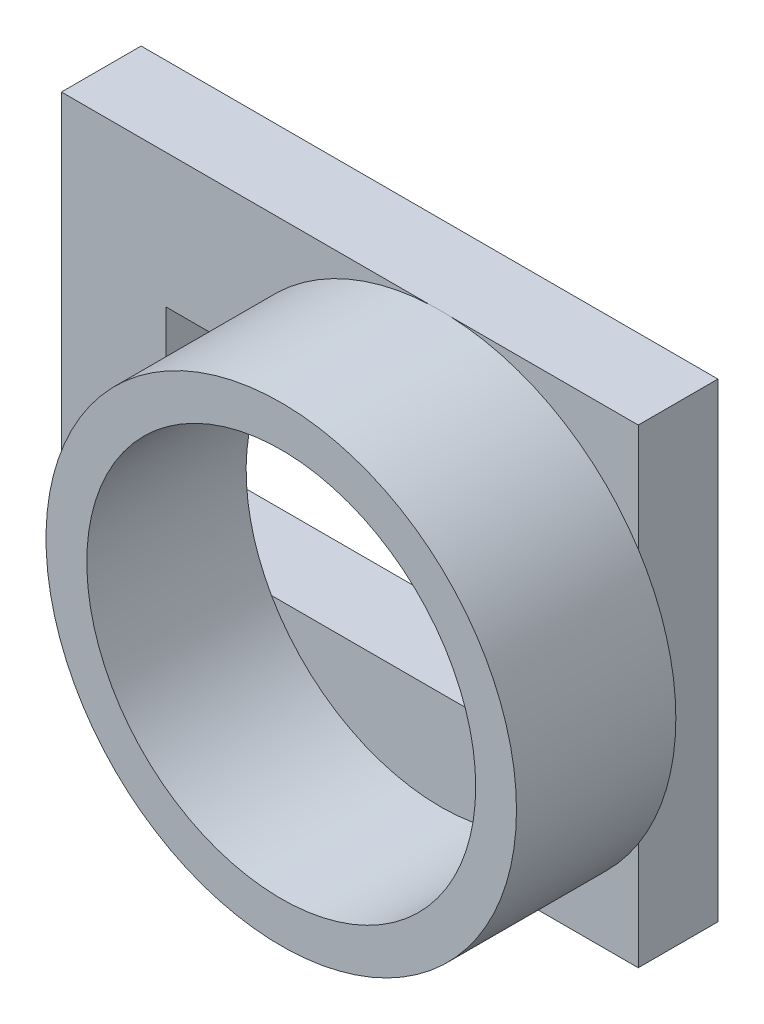
ISO-10303-21;
HEADER;
FILE_DESCRIPTION(('STEP AP214'),'2;1');
FILE_NAME('part.step','',(''),(''),'','','');
FILE_SCHEMA(('AUTOMOTIVE_DESIGN { 1 0 10303 214 1 1 1 1 }'));
ENDSEC;
DATA;
#1=APPLICATION_CONTEXT('core data for automotive mechanical design processes');
#2=APPLICATION_PROTOCOL_DEFINITION('international standard','automotive_design',2000,#1);
#3=PRODUCT_CONTEXT('',#1,'mechanical');
#4=PRODUCT('Part','Part','',(#3));
#5=PRODUCT_RELATED_PRODUCT_CATEGORY('part','',(#4));
#6=PRODUCT_DEFINITION_FORMATION('','',#4);
#7=PRODUCT_DEFINITION_CONTEXT('part definition',#1,'design');
#8=PRODUCT_DEFINITION('design','',#6,#7);
#9=PRODUCT_DEFINITION_SHAPE('','',#8);
#10=(LENGTH_UNIT() NAMED_UNIT(*) SI_UNIT(.MILLI.,.METRE.));
#11=(NAMED_UNIT(*) PLANE_ANGLE_UNIT() SI_UNIT($,.RADIAN.));
#12=(NAMED_UNIT(*) SI_UNIT($,.STERADIAN.) SOLID_ANGLE_UNIT());
#13=UNCERTAINTY_MEASURE_WITH_UNIT(LENGTH_MEASURE(1.E-05),#10,'distance_accuracy_value','');
#14=(GEOMETRIC_REPRESENTATION_CONTEXT(3) GLOBAL_UNCERTAINTY_ASSIGNED_CONTEXT((#13)) GLOBAL_UNIT_ASSIGNED_CONTEXT((#10,
#11,#12)) REPRESENTATION_CONTEXT('',''));
#15=CARTESIAN_POINT('',(0.,0.,0.));
#16=DIRECTION('',(0.,0.,1.));
#17=DIRECTION('',(1.,0.,0.));
#18=AXIS2_PLACEMENT_3D('',#15,#16,#17);
#19=CARTESIAN_POINT('',(0.,0.,5.));
#20=DIRECTION('',(0.,0.,-1.));
#21=DIRECTION('',(-1.,0.,0.));
#22=AXIS2_PLACEMENT_3D('',#19,#20,#21);
#23=PLANE('',#22);
#24=CARTESIAN_POINT('',(23.79465,14.75,5.));
#25=DIRECTION('',(0.,0.,1.));
#26=DIRECTION('',(1.,0.,0.));
#27=AXIS2_PLACEMENT_3D('',#24,#25,#26);
#28=CIRCLE('',#27,14.763665);
#29=CARTESIAN_POINT('',(36.2,22.7545671719166,5.));
#30=VERTEX_POINT('',#29);
#31=CARTESIAN_POINT('',(24.4297123845143,29.5,5.));
#32=VERTEX_POINT('',#31);
#33=EDGE_CURVE('E180',#30,#32,#28,.T.);
#34=ORIENTED_EDGE('',*,*,#33,.F.);
#35=DIRECTION('',(0.,1.,0.));
#36=VECTOR('',#35,1.);
#37=CARTESIAN_POINT('',(36.2,0.,5.));
#38=LINE('',#37,#36);
#39=CARTESIAN_POINT('',(36.2,29.5,5.));
#40=VERTEX_POINT('',#39);
#41=EDGE_CURVE('E173',#30,#40,#38,.T.);
#42=ORIENTED_EDGE('',*,*,#41,.T.);
#43=DIRECTION('',(-1.,0.,0.));
#44=VECTOR('',#43,1.);
#45=CARTESIAN_POINT('',(0.,29.5,5.));
#46=LINE('',#45,#44);
#47=EDGE_CURVE('E191',#40,#32,#46,.T.);
#48=ORIENTED_EDGE('',*,*,#47,.T.);
#49=EDGE_LOOP('',(#34,#42,#48));
#50=FACE_BOUND('',#49,.T.);
#51=ADVANCED_FACE('F41',(#50),#23,.F.);
#52=CARTESIAN_POINT('',(23.1595876154857,29.5,5.));
#53=VERTEX_POINT('',#52);
#54=CARTESIAN_POINT('',(10.4663603785885,21.1,5.));
#55=VERTEX_POINT('',#54);
#56=EDGE_CURVE('E11',#53,#55,#28,.T.);
#57=ORIENTED_EDGE('',*,*,#56,.F.);
#58=CARTESIAN_POINT('',(0.,29.5,5.));
#59=VERTEX_POINT('',#58);
#60=EDGE_CURVE('E202',#53,#59,#46,.T.);
#61=ORIENTED_EDGE('',*,*,#60,.T.);
#62=DIRECTION('',(0.,-1.,0.));
#63=VECTOR('',#62,1.);
#64=CARTESIAN_POINT('',(0.,0.,5.));
#65=LINE('',#64,#63);
#66=CARTESIAN_POINT('',(0.,0.,5.));
#67=VERTEX_POINT('',#66);
#68=EDGE_CURVE('E326',#59,#67,#65,.T.);
#69=ORIENTED_EDGE('',*,*,#68,.T.);
#70=DIRECTION('',(1.,0.,0.));
#71=VECTOR('',#70,1.);
#72=CARTESIAN_POINT('',(0.,0.,5.));
#73=LINE('',#72,#71);
#74=CARTESIAN_POINT('',(23.1595876154857,0.,5.));
#75=VERTEX_POINT('',#74);
#76=EDGE_CURVE('E196',#67,#75,#73,.T.);
#77=ORIENTED_EDGE('',*,*,#76,.T.);
#78=CARTESIAN_POINT('',(10.3149867908458,8.728,5.));
#79=VERTEX_POINT('',#78);
#80=EDGE_CURVE('E50',#79,#75,#28,.T.);
#81=ORIENTED_EDGE('',*,*,#80,.F.);
#82=DIRECTION('',(1.,0.,0.));
#83=VECTOR('',#82,1.);
#84=CARTESIAN_POINT('',(1.5735,8.728,5.));
#85=LINE('',#84,#83);
#86=CARTESIAN_POINT('',(6.5735,8.728,5.));
#87=VERTEX_POINT('',#86);
#88=EDGE_CURVE('E299',#87,#79,#85,.T.);
#89=ORIENTED_EDGE('',*,*,#88,.F.);
#90=DIRECTION('',(0.,1.,0.));
#91=VECTOR('',#90,1.);
#92=CARTESIAN_POINT('',(6.5735,21.1,5.));
#93=LINE('',#92,#91);
#94=CARTESIAN_POINT('',(6.5735,21.1,5.));
#95=VERTEX_POINT('',#94);
#96=EDGE_CURVE('E66',#87,#95,#93,.T.);
#97=ORIENTED_EDGE('',*,*,#96,.T.);
#98=DIRECTION('',(1.,0.,0.));
#99=VECTOR('',#98,1.);
#100=CARTESIAN_POINT('',(1.5735,21.1,5.));
#101=LINE('',#100,#99);
#102=EDGE_CURVE('E309',#95,#55,#101,.T.);
#103=ORIENTED_EDGE('',*,*,#102,.T.);
#104=EDGE_LOOP('',(#57,#61,#69,#77,#81,#89,#97,#103));
#105=FACE_BOUND('',#104,.T.);
#106=ADVANCED_FACE('F258',(#105),#23,.F.);
#107=CARTESIAN_POINT('',(13.180349789435,8.728,5.));
#108=VERTEX_POINT('',#107);
#109=CARTESIAN_POINT('',(29.6265,8.728,5.));
#110=VERTEX_POINT('',#109);
#111=EDGE_CURVE('E289',#108,#110,#85,.T.);
#112=ORIENTED_EDGE('',*,*,#111,.F.);
#113=CARTESIAN_POINT('',(23.79465,14.75,5.));
#114=DIRECTION('',(0.,0.,1.));
#115=DIRECTION('',(1.,0.,0.));
#116=AXIS2_PLACEMENT_3D('',#113,#114,#115);
#117=CIRCLE('',#116,12.2036);
#118=CARTESIAN_POINT('',(13.3732607951003,21.1,5.));
#119=VERTEX_POINT('',#118);
#120=EDGE_CURVE('E226',#108,#119,#117,.T.);
#121=ORIENTED_EDGE('',*,*,#120,.T.);
#122=CARTESIAN_POINT('',(29.6265,21.1,5.));
#123=VERTEX_POINT('',#122);
#124=EDGE_CURVE('E304',#119,#123,#101,.T.);
#125=ORIENTED_EDGE('',*,*,#124,.T.);
#126=DIRECTION('',(0.,-1.,0.));
#127=VECTOR('',#126,1.);
#128=CARTESIAN_POINT('',(29.6265,21.1,5.));
#129=LINE('',#128,#127);
#130=EDGE_CURVE('E292',#123,#110,#129,.T.);
#131=ORIENTED_EDGE('',*,*,#130,.T.);
#132=EDGE_LOOP('',(#112,#121,#125,#131));
#133=FACE_BOUND('',#132,.T.);
#134=ADVANCED_FACE('F265',(#133),#23,.F.);
#135=CARTESIAN_POINT('',(1.5735,21.1,0.));
#136=DIRECTION('',(-1.,0.,0.));
#137=DIRECTION('',(0.,-1.,0.));
#138=AXIS2_PLACEMENT_3D('',#135,#136,#137);
#139=PLANE('',#138);
#140=DIRECTION('',(0.,-1.,0.));
#141=VECTOR('',#140,1.);
#142=CARTESIAN_POINT('',(1.5735,21.1,1.5));
#143=LINE('',#142,#141);
#144=CARTESIAN_POINT('',(1.5735,21.1,1.5));
#145=VERTEX_POINT('',#144);
#146=CARTESIAN_POINT('',(1.5735,8.728,1.5));
#147=VERTEX_POINT('',#146);
#148=EDGE_CURVE('E339',#145,#147,#143,.T.);
#149=ORIENTED_EDGE('',*,*,#148,.T.);
#150=DIRECTION('',(0.,0.,1.));
#151=VECTOR('',#150,1.);
#152=CARTESIAN_POINT('',(1.5735,8.728,0.));
#153=LINE('',#152,#151);
#154=CARTESIAN_POINT('',(1.5735,8.728,0.));
#155=VERTEX_POINT('',#154);
#156=EDGE_CURVE('E313',#155,#147,#153,.T.);
#157=ORIENTED_EDGE('',*,*,#156,.F.);
#158=DIRECTION('',(0.,-1.,0.));
#159=VECTOR('',#158,1.);
#160=CARTESIAN_POINT('',(1.5735,21.1,0.));
#161=LINE('',#160,#159);
#162=CARTESIAN_POINT('',(1.5735,21.1,0.));
#163=VERTEX_POINT('',#162);
#164=EDGE_CURVE('E307',#163,#155,#161,.T.);
#165=ORIENTED_EDGE('',*,*,#164,.F.);
#166=DIRECTION('',(0.,0.,1.));
#167=VECTOR('',#166,1.);
#168=CARTESIAN_POINT('',(1.5735,21.1,0.));
#169=LINE('',#168,#167);
#170=EDGE_CURVE('E317',#163,#145,#169,.T.);
#171=ORIENTED_EDGE('',*,*,#170,.T.);
#172=EDGE_LOOP('',(#149,#157,#165,#171));
#173=FACE_BOUND('',#172,.T.);
#174=ADVANCED_FACE('F281',(#173),#139,.F.);
#175=CARTESIAN_POINT('',(0.,0.,5.));
#176=DIRECTION('',(1.,0.,0.));
#177=DIRECTION('',(0.,0.,-1.));
#178=AXIS2_PLACEMENT_3D('',#175,#176,#177);
#179=PLANE('',#178);
#180=DIRECTION('',(0.,-1.,0.));
#181=VECTOR('',#180,1.);
#182=CARTESIAN_POINT('',(0.,0.,0.));
#183=LINE('',#182,#181);
#184=CARTESIAN_POINT('',(0.,29.5,0.));
#185=VERTEX_POINT('',#184);
#186=CARTESIAN_POINT('',(0.,0.,0.));
#187=VERTEX_POINT('',#186);
#188=EDGE_CURVE('E316',#185,#187,#183,.T.);
#189=ORIENTED_EDGE('',*,*,#188,.T.);
#190=DIRECTION('',(0.,0.,-1.));
#191=VECTOR('',#190,1.);
#192=CARTESIAN_POINT('',(0.,0.,5.));
#193=LINE('',#192,#191);
#194=EDGE_CURVE('E45',#67,#187,#193,.T.);
#195=ORIENTED_EDGE('',*,*,#194,.F.);
#196=ORIENTED_EDGE('',*,*,#68,.F.);
#197=DIRECTION('',(0.,0.,-1.));
#198=VECTOR('',#197,1.);
#199=CARTESIAN_POINT('',(0.,29.5,5.));
#200=LINE('',#199,#198);
#201=EDGE_CURVE('E210',#59,#185,#200,.T.);
#202=ORIENTED_EDGE('',*,*,#201,.T.);
#203=EDGE_LOOP('',(#189,#195,#196,#202));
#204=FACE_BOUND('',#203,.T.);
#205=ADVANCED_FACE('F43',(#204),#179,.F.);
#206=CARTESIAN_POINT('',(0.,0.,5.));
#207=DIRECTION('',(0.,1.,0.));
#208=DIRECTION('',(0.,0.,1.));
#209=AXIS2_PLACEMENT_3D('',#206,#207,#208);
#210=PLANE('',#209);
#211=DIRECTION('',(1.,0.,0.));
#212=VECTOR('',#211,1.);
#213=CARTESIAN_POINT('',(0.,0.,0.));
#214=LINE('',#213,#212);
#215=CARTESIAN_POINT('',(36.2,0.,0.));
#216=VERTEX_POINT('',#215);
#217=EDGE_CURVE('E329',#187,#216,#214,.T.);
#218=ORIENTED_EDGE('',*,*,#217,.T.);
#219=DIRECTION('',(0.,0.,-1.));
#220=VECTOR('',#219,1.);
#221=CARTESIAN_POINT('',(36.2,0.,5.));
#222=LINE('',#221,#220);
#223=CARTESIAN_POINT('',(36.2,0.,5.));
#224=VERTEX_POINT('',#223);
#225=EDGE_CURVE('E217',#224,#216,#222,.T.);
#226=ORIENTED_EDGE('',*,*,#225,.F.);
#227=CARTESIAN_POINT('',(24.4297123845143,0.,5.));
#228=VERTEX_POINT('',#227);
#229=EDGE_CURVE('E200',#228,#224,#73,.T.);
#230=ORIENTED_EDGE('',*,*,#229,.F.);
#231=EDGE_CURVE('E198',#75,#228,#73,.T.);
#232=ORIENTED_EDGE('',*,*,#231,.F.);
#233=ORIENTED_EDGE('',*,*,#76,.F.);
#234=ORIENTED_EDGE('',*,*,#194,.T.);
#235=EDGE_LOOP('',(#218,#226,#230,#232,#233,#234));
#236=FACE_BOUND('',#235,.T.);
#237=ADVANCED_FACE('F332',(#236),#210,.F.);
#238=CARTESIAN_POINT('',(36.2,0.,5.));
#239=DIRECTION('',(-1.,0.,0.));
#240=DIRECTION('',(0.,0.,1.));
#241=AXIS2_PLACEMENT_3D('',#238,#239,#240);
#242=PLANE('',#241);
#243=DIRECTION('',(0.,1.,0.));
#244=VECTOR('',#243,1.);
#245=CARTESIAN_POINT('',(36.2,0.,0.));
#246=LINE('',#245,#244);
#247=CARTESIAN_POINT('',(36.2,29.5,0.));
#248=VERTEX_POINT('',#247);
#249=EDGE_CURVE('E327',#216,#248,#246,.T.);
#250=ORIENTED_EDGE('',*,*,#249,.T.);
#251=DIRECTION('',(0.,0.,-1.));
#252=VECTOR('',#251,1.);
#253=CARTESIAN_POINT('',(36.2,29.5,5.));
#254=LINE('',#253,#252);
#255=EDGE_CURVE('E195',#40,#248,#254,.T.);
#256=ORIENTED_EDGE('',*,*,#255,.F.);
#257=ORIENTED_EDGE('',*,*,#41,.F.);
#258=CARTESIAN_POINT('',(36.2,6.74543282808339,5.));
#259=VERTEX_POINT('',#258);
#260=EDGE_CURVE('E163',#259,#30,#38,.T.);
#261=ORIENTED_EDGE('',*,*,#260,.F.);
#262=EDGE_CURVE('E172',#224,#259,#38,.T.);
#263=ORIENTED_EDGE('',*,*,#262,.F.);
#264=ORIENTED_EDGE('',*,*,#225,.T.);
#265=EDGE_LOOP('',(#250,#256,#257,#261,#263,#264));
#266=FACE_BOUND('',#265,.T.);
#267=ADVANCED_FACE('F193',(#266),#242,.F.);
#268=CARTESIAN_POINT('',(0.,29.5,5.));
#269=DIRECTION('',(0.,-1.,0.));
#270=DIRECTION('',(0.,0.,-1.));
#271=AXIS2_PLACEMENT_3D('',#268,#269,#270);
#272=PLANE('',#271);
#273=DIRECTION('',(-1.,0.,0.));
#274=VECTOR('',#273,1.);
#275=CARTESIAN_POINT('',(0.,29.5,0.));
#276=LINE('',#275,#274);
#277=EDGE_CURVE('E220',#248,#185,#276,.T.);
#278=ORIENTED_EDGE('',*,*,#277,.T.);
#279=ORIENTED_EDGE('',*,*,#201,.F.);
#280=ORIENTED_EDGE('',*,*,#60,.F.);
#281=EDGE_CURVE('E204',#32,#53,#46,.T.);
#282=ORIENTED_EDGE('',*,*,#281,.F.);
#283=ORIENTED_EDGE('',*,*,#47,.F.);
#284=ORIENTED_EDGE('',*,*,#255,.T.);
#285=EDGE_LOOP('',(#278,#279,#280,#282,#283,#284));
#286=FACE_BOUND('',#285,.T.);
#287=ADVANCED_FACE('F270',(#286),#272,.F.);
#288=EDGE_CURVE('E184',#228,#259,#28,.T.);
#289=ORIENTED_EDGE('',*,*,#288,.F.);
#290=ORIENTED_EDGE('',*,*,#229,.T.);
#291=ORIENTED_EDGE('',*,*,#262,.T.);
#292=EDGE_LOOP('',(#289,#290,#291));
#293=FACE_BOUND('',#292,.T.);
#294=ADVANCED_FACE('F260',(#293),#23,.F.);
#295=CARTESIAN_POINT('',(0.,0.,0.));
#296=DIRECTION('',(0.,0.,-1.));
#297=DIRECTION('',(-1.,0.,0.));
#298=AXIS2_PLACEMENT_3D('',#295,#296,#297);
#299=PLANE('',#298);
#300=DIRECTION('',(1.,0.,0.));
#301=VECTOR('',#300,1.);
#302=CARTESIAN_POINT('',(1.5735,8.728,0.));
#303=LINE('',#302,#301);
#304=CARTESIAN_POINT('',(34.6265,8.728,0.));
#305=VERTEX_POINT('',#304);
#306=EDGE_CURVE('E311',#155,#305,#303,.T.);
#307=ORIENTED_EDGE('',*,*,#306,.T.);
#308=DIRECTION('',(0.,-1.,0.));
#309=VECTOR('',#308,1.);
#310=CARTESIAN_POINT('',(34.6265,21.1,0.));
#311=LINE('',#310,#309);
#312=CARTESIAN_POINT('',(34.6265,21.1,0.));
#313=VERTEX_POINT('',#312);
#314=EDGE_CURVE('E372',#313,#305,#311,.T.);
#315=ORIENTED_EDGE('',*,*,#314,.F.);
#316=DIRECTION('',(1.,0.,0.));
#317=VECTOR('',#316,1.);
#318=CARTESIAN_POINT('',(1.5735,21.1,0.));
#319=LINE('',#318,#317);
#320=EDGE_CURVE('E373',#163,#313,#319,.T.);
#321=ORIENTED_EDGE('',*,*,#320,.F.);
#322=ORIENTED_EDGE('',*,*,#164,.T.);
#323=EDGE_LOOP('',(#307,#315,#321,#322));
#324=FACE_BOUND('',#323,.T.);
#325=ORIENTED_EDGE('',*,*,#188,.F.);
#326=ORIENTED_EDGE('',*,*,#277,.F.);
#327=ORIENTED_EDGE('',*,*,#249,.F.);
#328=ORIENTED_EDGE('',*,*,#217,.F.);
#329=EDGE_LOOP('',(#325,#326,#327,#328));
#330=FACE_BOUND('',#329,.T.);
#331=ADVANCED_FACE('F269',(#324,#330),#299,.T.);
#332=CARTESIAN_POINT('',(1.5735,8.728,0.));
#333=DIRECTION('',(0.,-1.,0.));
#334=DIRECTION('',(0.,0.,-1.));
#335=AXIS2_PLACEMENT_3D('',#332,#333,#334);
#336=PLANE('',#335);
#337=DIRECTION('',(1.,0.,0.));
#338=VECTOR('',#337,1.);
#339=CARTESIAN_POINT('',(1.5735,8.728,1.5));
#340=LINE('',#339,#338);
#341=CARTESIAN_POINT('',(6.5735,8.728,1.5));
#342=VERTEX_POINT('',#341);
#343=EDGE_CURVE('E342',#147,#342,#340,.T.);
#344=ORIENTED_EDGE('',*,*,#343,.T.);
#345=DIRECTION('',(0.,0.,1.));
#346=VECTOR('',#345,1.);
#347=CARTESIAN_POINT('',(6.5735,8.728,1.5));
#348=LINE('',#347,#346);
#349=EDGE_CURVE('E349',#342,#87,#348,.T.);
#350=ORIENTED_EDGE('',*,*,#349,.T.);
#351=ORIENTED_EDGE('',*,*,#88,.T.);
#352=EDGE_CURVE('E296',#79,#108,#85,.T.);
#353=ORIENTED_EDGE('',*,*,#352,.T.);
#354=ORIENTED_EDGE('',*,*,#111,.T.);
#355=DIRECTION('',(0.,0.,1.));
#356=VECTOR('',#355,1.);
#357=CARTESIAN_POINT('',(29.6265,8.728,1.5));
#358=LINE('',#357,#356);
#359=CARTESIAN_POINT('',(29.6265,8.728,1.5));
#360=VERTEX_POINT('',#359);
#361=EDGE_CURVE('E357',#360,#110,#358,.T.);
#362=ORIENTED_EDGE('',*,*,#361,.F.);
#363=DIRECTION('',(1.,0.,0.));
#364=VECTOR('',#363,1.);
#365=CARTESIAN_POINT('',(34.6265,8.728,1.5));
#366=LINE('',#365,#364);
#367=CARTESIAN_POINT('',(34.6265,8.728,1.5));
#368=VERTEX_POINT('',#367);
#369=EDGE_CURVE('E356',#360,#368,#366,.T.);
#370=ORIENTED_EDGE('',*,*,#369,.T.);
#371=DIRECTION('',(0.,0.,1.));
#372=VECTOR('',#371,1.);
#373=CARTESIAN_POINT('',(34.6265,8.728,0.));
#374=LINE('',#373,#372);
#375=EDGE_CURVE('E323',#305,#368,#374,.T.);
#376=ORIENTED_EDGE('',*,*,#375,.F.);
#377=ORIENTED_EDGE('',*,*,#306,.F.);
#378=ORIENTED_EDGE('',*,*,#156,.T.);
#379=EDGE_LOOP('',(#344,#350,#351,#353,#354,#362,#370,#376,#377,#378));
#380=FACE_BOUND('',#379,.T.);
#381=ADVANCED_FACE('F276',(#380),#336,.F.);
#382=CARTESIAN_POINT('',(1.5735,21.1,0.));
#383=DIRECTION('',(0.,-1.,0.));
#384=DIRECTION('',(1.,0.,0.));
#385=AXIS2_PLACEMENT_3D('',#382,#383,#384);
#386=PLANE('',#385);
#387=DIRECTION('',(0.,0.,1.));
#388=VECTOR('',#387,1.);
#389=CARTESIAN_POINT('',(6.5735,21.1,1.5));
#390=LINE('',#389,#388);
#391=CARTESIAN_POINT('',(6.5735,21.1,1.5));
#392=VERTEX_POINT('',#391);
#393=EDGE_CURVE('E297',#392,#95,#390,.T.);
#394=ORIENTED_EDGE('',*,*,#393,.F.);
#395=DIRECTION('',(-1.,0.,0.));
#396=VECTOR('',#395,1.);
#397=CARTESIAN_POINT('',(1.5735,21.1,1.5));
#398=LINE('',#397,#396);
#399=EDGE_CURVE('E346',#392,#145,#398,.T.);
#400=ORIENTED_EDGE('',*,*,#399,.T.);
#401=ORIENTED_EDGE('',*,*,#170,.F.);
#402=ORIENTED_EDGE('',*,*,#320,.T.);
#403=DIRECTION('',(0.,0.,1.));
#404=VECTOR('',#403,1.);
#405=CARTESIAN_POINT('',(34.6265,21.1,0.));
#406=LINE('',#405,#404);
#407=CARTESIAN_POINT('',(34.6265,21.1,1.5));
#408=VERTEX_POINT('',#407);
#409=EDGE_CURVE('E320',#313,#408,#406,.T.);
#410=ORIENTED_EDGE('',*,*,#409,.T.);
#411=DIRECTION('',(-1.,0.,0.));
#412=VECTOR('',#411,1.);
#413=CARTESIAN_POINT('',(34.6265,21.1,1.5));
#414=LINE('',#413,#412);
#415=CARTESIAN_POINT('',(29.6265,21.1,1.5));
#416=VERTEX_POINT('',#415);
#417=EDGE_CURVE('E365',#408,#416,#414,.T.);
#418=ORIENTED_EDGE('',*,*,#417,.T.);
#419=DIRECTION('',(0.,0.,1.));
#420=VECTOR('',#419,1.);
#421=CARTESIAN_POINT('',(29.6265,21.1,1.5));
#422=LINE('',#421,#420);
#423=EDGE_CURVE('E353',#416,#123,#422,.T.);
#424=ORIENTED_EDGE('',*,*,#423,.T.);
#425=ORIENTED_EDGE('',*,*,#124,.F.);
#426=EDGE_CURVE('E312',#55,#119,#101,.T.);
#427=ORIENTED_EDGE('',*,*,#426,.F.);
#428=ORIENTED_EDGE('',*,*,#102,.F.);
#429=EDGE_LOOP('',(#394,#400,#401,#402,#410,#418,#424,#425,#427,#428));
#430=FACE_BOUND('',#429,.T.);
#431=ADVANCED_FACE('F386',(#430),#386,.T.);
#432=CARTESIAN_POINT('',(34.6265,21.1,0.));
#433=DIRECTION('',(-1.,0.,0.));
#434=DIRECTION('',(0.,-1.,0.));
#435=AXIS2_PLACEMENT_3D('',#432,#433,#434);
#436=PLANE('',#435);
#437=DIRECTION('',(0.,1.,0.));
#438=VECTOR('',#437,1.);
#439=CARTESIAN_POINT('',(34.6265,21.1,1.5));
#440=LINE('',#439,#438);
#441=EDGE_CURVE('E360',#368,#408,#440,.T.);
#442=ORIENTED_EDGE('',*,*,#441,.T.);
#443=ORIENTED_EDGE('',*,*,#409,.F.);
#444=ORIENTED_EDGE('',*,*,#314,.T.);
#445=ORIENTED_EDGE('',*,*,#375,.T.);
#446=EDGE_LOOP('',(#442,#443,#444,#445));
#447=FACE_BOUND('',#446,.T.);
#448=ADVANCED_FACE('F384',(#447),#436,.T.);
#449=CARTESIAN_POINT('',(29.6265,21.1,1.5));
#450=DIRECTION('',(-1.,0.,0.));
#451=DIRECTION('',(0.,0.,1.));
#452=AXIS2_PLACEMENT_3D('',#449,#450,#451);
#453=PLANE('',#452);
#454=ORIENTED_EDGE('',*,*,#130,.F.);
#455=ORIENTED_EDGE('',*,*,#423,.F.);
#456=DIRECTION('',(0.,-1.,0.));
#457=VECTOR('',#456,1.);
#458=CARTESIAN_POINT('',(29.6265,21.1,1.5));
#459=LINE('',#458,#457);
#460=EDGE_CURVE('E363',#416,#360,#459,.T.);
#461=ORIENTED_EDGE('',*,*,#460,.T.);
#462=ORIENTED_EDGE('',*,*,#361,.T.);
#463=EDGE_LOOP('',(#454,#455,#461,#462));
#464=FACE_BOUND('',#463,.T.);
#465=ADVANCED_FACE('F391',(#464),#453,.T.);
#466=CARTESIAN_POINT('',(0.,0.,1.5));
#467=DIRECTION('',(0.,0.,-1.));
#468=DIRECTION('',(-1.,0.,0.));
#469=AXIS2_PLACEMENT_3D('',#466,#467,#468);
#470=PLANE('',#469);
#471=ORIENTED_EDGE('',*,*,#441,.F.);
#472=ORIENTED_EDGE('',*,*,#369,.F.);
#473=ORIENTED_EDGE('',*,*,#460,.F.);
#474=ORIENTED_EDGE('',*,*,#417,.F.);
#475=EDGE_LOOP('',(#471,#472,#473,#474));
#476=FACE_BOUND('',#475,.T.);
#477=ADVANCED_FACE('F389',(#476),#470,.T.);
#478=CARTESIAN_POINT('',(6.5735,21.1,1.5));
#479=DIRECTION('',(1.,0.,0.));
#480=DIRECTION('',(0.,1.,0.));
#481=AXIS2_PLACEMENT_3D('',#478,#479,#480);
#482=PLANE('',#481);
#483=ORIENTED_EDGE('',*,*,#96,.F.);
#484=ORIENTED_EDGE('',*,*,#349,.F.);
#485=DIRECTION('',(0.,1.,0.));
#486=VECTOR('',#485,1.);
#487=CARTESIAN_POINT('',(6.5735,21.1,1.5));
#488=LINE('',#487,#486);
#489=EDGE_CURVE('E344',#342,#392,#488,.T.);
#490=ORIENTED_EDGE('',*,*,#489,.T.);
#491=ORIENTED_EDGE('',*,*,#393,.T.);
#492=EDGE_LOOP('',(#483,#484,#490,#491));
#493=FACE_BOUND('',#492,.T.);
#494=ADVANCED_FACE('F398',(#493),#482,.T.);
#495=CARTESIAN_POINT('',(0.,0.,1.5));
#496=DIRECTION('',(0.,0.,1.));
#497=DIRECTION('',(1.,0.,0.));
#498=AXIS2_PLACEMENT_3D('',#495,#496,#497);
#499=PLANE('',#498);
#500=ORIENTED_EDGE('',*,*,#148,.F.);
#501=ORIENTED_EDGE('',*,*,#399,.F.);
#502=ORIENTED_EDGE('',*,*,#489,.F.);
#503=ORIENTED_EDGE('',*,*,#343,.F.);
#504=EDGE_LOOP('',(#500,#501,#502,#503));
#505=FACE_BOUND('',#504,.T.);
#506=ADVANCED_FACE('F421',(#505),#499,.F.);
#507=CARTESIAN_POINT('',(23.79465,14.75,5.));
#508=DIRECTION('',(0.,0.,1.));
#509=DIRECTION('',(1.,0.,0.));
#510=AXIS2_PLACEMENT_3D('',#507,#508,#509);
#511=PLANE('',#510);
#512=EDGE_CURVE('E185',#75,#228,#28,.T.);
#513=ORIENTED_EDGE('',*,*,#512,.F.);
#514=ORIENTED_EDGE('',*,*,#231,.T.);
#515=EDGE_LOOP('',(#513,#514));
#516=FACE_BOUND('',#515,.T.);
#517=ADVANCED_FACE('F253',(#516),#511,.F.);
#518=EDGE_CURVE('E166',#259,#30,#28,.T.);
#519=ORIENTED_EDGE('',*,*,#518,.F.);
#520=ORIENTED_EDGE('',*,*,#260,.T.);
#521=EDGE_LOOP('',(#519,#520));
#522=FACE_BOUND('',#521,.T.);
#523=ADVANCED_FACE('F165',(#522),#511,.F.);
#524=EDGE_CURVE('E52',#32,#53,#28,.T.);
#525=ORIENTED_EDGE('',*,*,#524,.F.);
#526=ORIENTED_EDGE('',*,*,#281,.T.);
#527=EDGE_LOOP('',(#525,#526));
#528=FACE_BOUND('',#527,.T.);
#529=ADVANCED_FACE('F245',(#528),#511,.F.);
#530=CARTESIAN_POINT('',(23.79465,14.75,15.));
#531=DIRECTION('',(0.,0.,1.));
#532=DIRECTION('',(1.,0.,0.));
#533=AXIS2_PLACEMENT_3D('',#530,#531,#532);
#534=PLANE('',#533);
#535=CARTESIAN_POINT('',(23.79465,14.75,15.));
#536=DIRECTION('',(0.,0.,1.));
#537=DIRECTION('',(1.,0.,0.));
#538=AXIS2_PLACEMENT_3D('',#535,#536,#537);
#539=CIRCLE('',#538,14.763665);
#540=CARTESIAN_POINT('',(38.558315,14.75,15.));
#541=VERTEX_POINT('',#540);
#542=EDGE_CURVE('E192',#541,#541,#539,.T.);
#543=ORIENTED_EDGE('',*,*,#542,.T.);
#544=EDGE_LOOP('',(#543));
#545=FACE_BOUND('',#544,.T.);
#546=CARTESIAN_POINT('',(23.79465,14.75,15.));
#547=DIRECTION('',(0.,0.,1.));
#548=DIRECTION('',(1.,0.,0.));
#549=AXIS2_PLACEMENT_3D('',#546,#547,#548);
#550=CIRCLE('',#549,12.2036);
#551=CARTESIAN_POINT('',(35.99825,14.75,15.));
#552=VERTEX_POINT('',#551);
#553=EDGE_CURVE('E186',#552,#552,#550,.T.);
#554=ORIENTED_EDGE('',*,*,#553,.F.);
#555=EDGE_LOOP('',(#554));
#556=FACE_BOUND('',#555,.T.);
#557=ADVANCED_FACE('F242',(#545,#556),#534,.T.);
#558=ORIENTED_EDGE('',*,*,#352,.F.);
#559=EDGE_CURVE('E472',#55,#79,#28,.T.);
#560=ORIENTED_EDGE('',*,*,#559,.F.);
#561=ORIENTED_EDGE('',*,*,#426,.T.);
#562=EDGE_CURVE('E58',#119,#108,#117,.T.);
#563=ORIENTED_EDGE('',*,*,#562,.T.);
#564=EDGE_LOOP('',(#558,#560,#561,#563));
#565=FACE_BOUND('',#564,.T.);
#566=ADVANCED_FACE('F244',(#565),#511,.F.);
#567=CARTESIAN_POINT('',(23.79465,14.75,15.));
#568=DIRECTION('',(0.,0.,-1.));
#569=DIRECTION('',(-1.,0.,0.));
#570=AXIS2_PLACEMENT_3D('',#567,#568,#569);
#571=CYLINDRICAL_SURFACE('',#570,14.763665);
#572=ORIENTED_EDGE('',*,*,#542,.F.);
#573=EDGE_LOOP('',(#572));
#574=FACE_BOUND('',#573,.T.);
#575=ORIENTED_EDGE('',*,*,#33,.T.);
#576=ORIENTED_EDGE('',*,*,#524,.T.);
#577=ORIENTED_EDGE('',*,*,#56,.T.);
#578=ORIENTED_EDGE('',*,*,#559,.T.);
#579=ORIENTED_EDGE('',*,*,#80,.T.);
#580=ORIENTED_EDGE('',*,*,#512,.T.);
#581=ORIENTED_EDGE('',*,*,#288,.T.);
#582=ORIENTED_EDGE('',*,*,#518,.T.);
#583=EDGE_LOOP('',(#575,#576,#577,#578,#579,#580,#581,#582));
#584=FACE_BOUND('',#583,.T.);
#585=ADVANCED_FACE('F178',(#574,#584),#571,.T.);
#586=CARTESIAN_POINT('',(23.79465,14.75,15.));
#587=DIRECTION('',(0.,0.,-1.));
#588=DIRECTION('',(-1.,0.,0.));
#589=AXIS2_PLACEMENT_3D('',#586,#587,#588);
#590=CYLINDRICAL_SURFACE('',#589,12.2036);
#591=ORIENTED_EDGE('',*,*,#553,.T.);
#592=EDGE_LOOP('',(#591));
#593=FACE_BOUND('',#592,.T.);
#594=ORIENTED_EDGE('',*,*,#562,.F.);
#595=ORIENTED_EDGE('',*,*,#120,.F.);
#596=EDGE_LOOP('',(#594,#595));
#597=FACE_BOUND('',#596,.T.);
#598=ADVANCED_FACE('F240',(#593,#597),#590,.F.);
#599=CLOSED_SHELL('',(#51,#106,#134,#174,#205,#237,#267,#287,#294,#331,#381,#431,#448,#465,#477,
#494,#506,#517,#523,#529,#557,#566,#585,#598));
#600=MANIFOLD_SOLID_BREP('B2',#599);
#601=ADVANCED_BREP_SHAPE_REPRESENTATION('',(#18,#600),#14);
#602=SHAPE_DEFINITION_REPRESENTATION(#9,#601);
ENDSEC;
END-ISO-10303-21;
